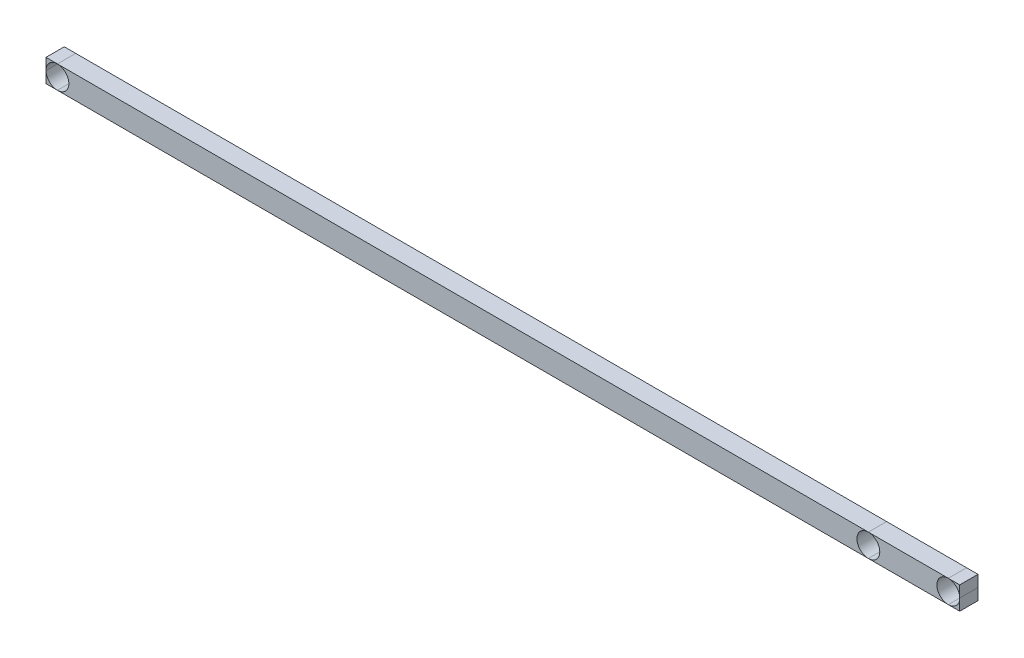
ISO-10303-21;
HEADER;
FILE_DESCRIPTION(('STEP AP214'),'2;1');
FILE_NAME('part.step','',(''),(''),'','','');
FILE_SCHEMA(('AUTOMOTIVE_DESIGN { 1 0 10303 214 1 1 1 1 }'));
ENDSEC;
DATA;
#1=APPLICATION_CONTEXT('core data for automotive mechanical design processes');
#2=APPLICATION_PROTOCOL_DEFINITION('international standard','automotive_design',2000,#1);
#3=PRODUCT_CONTEXT('',#1,'mechanical');
#4=PRODUCT('Part','Part','',(#3));
#5=PRODUCT_RELATED_PRODUCT_CATEGORY('part','',(#4));
#6=PRODUCT_DEFINITION_FORMATION('','',#4);
#7=PRODUCT_DEFINITION_CONTEXT('part definition',#1,'design');
#8=PRODUCT_DEFINITION('design','',#6,#7);
#9=PRODUCT_DEFINITION_SHAPE('','',#8);
#10=(LENGTH_UNIT() NAMED_UNIT(*) SI_UNIT(.MILLI.,.METRE.));
#11=(NAMED_UNIT(*) PLANE_ANGLE_UNIT() SI_UNIT($,.RADIAN.));
#12=(NAMED_UNIT(*) SI_UNIT($,.STERADIAN.) SOLID_ANGLE_UNIT());
#13=UNCERTAINTY_MEASURE_WITH_UNIT(LENGTH_MEASURE(1.E-05),#10,'distance_accuracy_value','');
#14=(GEOMETRIC_REPRESENTATION_CONTEXT(3) GLOBAL_UNCERTAINTY_ASSIGNED_CONTEXT((#13)) GLOBAL_UNIT_ASSIGNED_CONTEXT((#10,
#11,#12)) REPRESENTATION_CONTEXT('',''));
#15=CARTESIAN_POINT('',(0.,0.,0.));
#16=DIRECTION('',(0.,0.,1.));
#17=DIRECTION('',(1.,0.,0.));
#18=AXIS2_PLACEMENT_3D('',#15,#16,#17);
#19=CARTESIAN_POINT('',(0.,0.,4.));
#20=DIRECTION('',(1.,0.,0.));
#21=DIRECTION('',(0.,1.,0.));
#22=AXIS2_PLACEMENT_3D('',#19,#20,#21);
#23=PLANE('',#22);
#24=DIRECTION('',(0.,0.,1.));
#25=VECTOR('',#24,1.);
#26=CARTESIAN_POINT('',(0.,-2.5,-6.));
#27=LINE('',#26,#25);
#28=CARTESIAN_POINT('',(0.,-2.5,0.));
#29=VERTEX_POINT('',#28);
#30=CARTESIAN_POINT('',(0.,-2.5,4.));
#31=VERTEX_POINT('',#30);
#32=EDGE_CURVE('E62',#29,#31,#27,.T.);
#33=ORIENTED_EDGE('',*,*,#32,.F.);
#34=DIRECTION('',(0.,-1.,0.));
#35=VECTOR('',#34,1.);
#36=CARTESIAN_POINT('',(0.,0.,0.));
#37=LINE('',#36,#35);
#38=CARTESIAN_POINT('',(0.,-5.,0.));
#39=VERTEX_POINT('',#38);
#40=EDGE_CURVE('E97',#29,#39,#37,.T.);
#41=ORIENTED_EDGE('',*,*,#40,.T.);
#42=DIRECTION('',(0.,0.,-1.));
#43=VECTOR('',#42,1.);
#44=CARTESIAN_POINT('',(0.,-5.,4.));
#45=LINE('',#44,#43);
#46=CARTESIAN_POINT('',(0.,-5.,4.));
#47=VERTEX_POINT('',#46);
#48=EDGE_CURVE('E89',#47,#39,#45,.T.);
#49=ORIENTED_EDGE('',*,*,#48,.F.);
#50=DIRECTION('',(0.,-1.,0.));
#51=VECTOR('',#50,1.);
#52=CARTESIAN_POINT('',(0.,0.,4.));
#53=LINE('',#52,#51);
#54=EDGE_CURVE('E92',#31,#47,#53,.T.);
#55=ORIENTED_EDGE('',*,*,#54,.F.);
#56=EDGE_LOOP('',(#33,#41,#49,#55));
#57=FACE_BOUND('',#56,.T.);
#58=ADVANCED_FACE('F52',(#57),#23,.F.);
#59=CARTESIAN_POINT('',(0.,0.,4.));
#60=DIRECTION('',(0.,0.,1.));
#61=DIRECTION('',(1.,0.,0.));
#62=AXIS2_PLACEMENT_3D('',#59,#60,#61);
#63=PLANE('',#62);
#64=CARTESIAN_POINT('',(2.5,-2.5,4.));
#65=DIRECTION('',(0.,0.,1.));
#66=DIRECTION('',(1.,0.,0.));
#67=AXIS2_PLACEMENT_3D('',#64,#65,#66);
#68=CIRCLE('',#67,2.5);
#69=CARTESIAN_POINT('',(2.5,-5.,4.));
#70=VERTEX_POINT('',#69);
#71=EDGE_CURVE('E12',#31,#70,#68,.T.);
#72=ORIENTED_EDGE('',*,*,#71,.F.);
#73=ORIENTED_EDGE('',*,*,#54,.T.);
#74=DIRECTION('',(1.,0.,0.));
#75=VECTOR('',#74,1.);
#76=CARTESIAN_POINT('',(0.,-5.,4.));
#77=LINE('',#76,#75);
#78=EDGE_CURVE('E56',#47,#70,#77,.T.);
#79=ORIENTED_EDGE('',*,*,#78,.T.);
#80=EDGE_LOOP('',(#72,#73,#79));
#81=FACE_BOUND('',#80,.T.);
#82=ADVANCED_FACE('F99',(#81),#63,.T.);
#83=CARTESIAN_POINT('',(0.,0.,0.));
#84=DIRECTION('',(0.,0.,1.));
#85=DIRECTION('',(1.,0.,0.));
#86=AXIS2_PLACEMENT_3D('',#83,#84,#85);
#87=PLANE('',#86);
#88=ORIENTED_EDGE('',*,*,#40,.F.);
#89=CARTESIAN_POINT('',(2.5,-2.5,0.));
#90=DIRECTION('',(0.,0.,1.));
#91=DIRECTION('',(1.,0.,0.));
#92=AXIS2_PLACEMENT_3D('',#89,#90,#91);
#93=CIRCLE('',#92,2.5);
#94=CARTESIAN_POINT('',(2.5,-5.,0.));
#95=VERTEX_POINT('',#94);
#96=EDGE_CURVE('E82',#29,#95,#93,.T.);
#97=ORIENTED_EDGE('',*,*,#96,.T.);
#98=DIRECTION('',(1.,0.,0.));
#99=VECTOR('',#98,1.);
#100=CARTESIAN_POINT('',(0.,-5.,0.));
#101=LINE('',#100,#99);
#102=EDGE_CURVE('E101',#39,#95,#101,.T.);
#103=ORIENTED_EDGE('',*,*,#102,.F.);
#104=EDGE_LOOP('',(#88,#97,#103));
#105=FACE_BOUND('',#104,.T.);
#106=ADVANCED_FACE('F108',(#105),#87,.F.);
#107=CARTESIAN_POINT('',(0.,-5.,4.));
#108=DIRECTION('',(0.,1.,0.));
#109=DIRECTION('',(0.,0.,1.));
#110=AXIS2_PLACEMENT_3D('',#107,#108,#109);
#111=PLANE('',#110);
#112=ORIENTED_EDGE('',*,*,#102,.T.);
#113=DIRECTION('',(0.,0.,1.));
#114=VECTOR('',#113,1.);
#115=CARTESIAN_POINT('',(2.5,-5.,-6.));
#116=LINE('',#115,#114);
#117=EDGE_CURVE('E69',#95,#70,#116,.T.);
#118=ORIENTED_EDGE('',*,*,#117,.T.);
#119=ORIENTED_EDGE('',*,*,#78,.F.);
#120=ORIENTED_EDGE('',*,*,#48,.T.);
#121=EDGE_LOOP('',(#112,#118,#119,#120));
#122=FACE_BOUND('',#121,.T.);
#123=ADVANCED_FACE('F54',(#122),#111,.F.);
#124=CARTESIAN_POINT('',(2.5,-2.5,-6.));
#125=DIRECTION('',(0.,0.,1.));
#126=DIRECTION('',(1.,0.,0.));
#127=AXIS2_PLACEMENT_3D('',#124,#125,#126);
#128=CYLINDRICAL_SURFACE('',#127,2.5);
#129=ORIENTED_EDGE('',*,*,#96,.F.);
#130=ORIENTED_EDGE('',*,*,#32,.T.);
#131=ORIENTED_EDGE('',*,*,#71,.T.);
#132=ORIENTED_EDGE('',*,*,#117,.F.);
#133=EDGE_LOOP('',(#129,#130,#131,#132));
#134=FACE_BOUND('',#133,.T.);
#135=ADVANCED_FACE('F85',(#134),#128,.F.);
#136=CLOSED_SHELL('',(#58,#82,#106,#123,#135));
#137=MANIFOLD_SOLID_BREP('B2',#136);
#138=CARTESIAN_POINT('',(0.,0.,4.));
#139=DIRECTION('',(0.,0.,1.));
#140=DIRECTION('',(1.,0.,0.));
#141=AXIS2_PLACEMENT_3D('',#138,#139,#140);
#142=PLANE('',#141);
#143=CARTESIAN_POINT('',(197.5,-2.5,4.));
#144=DIRECTION('',(0.,0.,1.));
#145=DIRECTION('',(1.,0.,0.));
#146=AXIS2_PLACEMENT_3D('',#143,#144,#145);
#147=CIRCLE('',#146,2.5);
#148=CARTESIAN_POINT('',(197.5,0.,4.));
#149=VERTEX_POINT('',#148);
#150=CARTESIAN_POINT('',(197.5,-5.,4.));
#151=VERTEX_POINT('',#150);
#152=EDGE_CURVE('E50',#149,#151,#147,.T.);
#153=ORIENTED_EDGE('',*,*,#152,.F.);
#154=DIRECTION('',(-1.,0.,0.));
#155=VECTOR('',#154,1.);
#156=CARTESIAN_POINT('',(0.,0.,4.));
#157=LINE('',#156,#155);
#158=CARTESIAN_POINT('',(180.,0.,4.));
#159=VERTEX_POINT('',#158);
#160=EDGE_CURVE('E221',#149,#159,#157,.T.);
#161=ORIENTED_EDGE('',*,*,#160,.T.);
#162=CARTESIAN_POINT('',(180.,-2.5,4.));
#163=DIRECTION('',(0.,0.,1.));
#164=DIRECTION('',(1.,0.,0.));
#165=AXIS2_PLACEMENT_3D('',#162,#163,#164);
#166=CIRCLE('',#165,2.5);
#167=CARTESIAN_POINT('',(180.,-5.,4.));
#168=VERTEX_POINT('',#167);
#169=EDGE_CURVE('E215',#168,#159,#166,.T.);
#170=ORIENTED_EDGE('',*,*,#169,.F.);
#171=DIRECTION('',(1.,0.,0.));
#172=VECTOR('',#171,1.);
#173=CARTESIAN_POINT('',(0.,-5.,4.));
#174=LINE('',#173,#172);
#175=EDGE_CURVE('E164',#168,#151,#174,.T.);
#176=ORIENTED_EDGE('',*,*,#175,.T.);
#177=EDGE_LOOP('',(#153,#161,#170,#176));
#178=FACE_BOUND('',#177,.T.);
#179=ADVANCED_FACE('F160',(#178),#142,.T.);
#180=CARTESIAN_POINT('',(0.,0.,0.));
#181=DIRECTION('',(0.,0.,1.));
#182=DIRECTION('',(1.,0.,0.));
#183=AXIS2_PLACEMENT_3D('',#180,#181,#182);
#184=PLANE('',#183);
#185=DIRECTION('',(-1.,0.,0.));
#186=VECTOR('',#185,1.);
#187=CARTESIAN_POINT('',(0.,0.,0.));
#188=LINE('',#187,#186);
#189=CARTESIAN_POINT('',(197.5,0.,0.));
#190=VERTEX_POINT('',#189);
#191=CARTESIAN_POINT('',(180.,0.,0.));
#192=VERTEX_POINT('',#191);
#193=EDGE_CURVE('E207',#190,#192,#188,.T.);
#194=ORIENTED_EDGE('',*,*,#193,.F.);
#195=CARTESIAN_POINT('',(197.5,-2.5,0.));
#196=DIRECTION('',(0.,0.,1.));
#197=DIRECTION('',(1.,0.,0.));
#198=AXIS2_PLACEMENT_3D('',#195,#196,#197);
#199=CIRCLE('',#198,2.5);
#200=CARTESIAN_POINT('',(197.5,-5.,0.));
#201=VERTEX_POINT('',#200);
#202=EDGE_CURVE('E208',#190,#201,#199,.T.);
#203=ORIENTED_EDGE('',*,*,#202,.T.);
#204=DIRECTION('',(1.,0.,0.));
#205=VECTOR('',#204,1.);
#206=CARTESIAN_POINT('',(0.,-5.,0.));
#207=LINE('',#206,#205);
#208=CARTESIAN_POINT('',(180.,-5.,0.));
#209=VERTEX_POINT('',#208);
#210=EDGE_CURVE('E211',#209,#201,#207,.T.);
#211=ORIENTED_EDGE('',*,*,#210,.F.);
#212=CARTESIAN_POINT('',(180.,-2.5,0.));
#213=DIRECTION('',(0.,0.,1.));
#214=DIRECTION('',(1.,0.,0.));
#215=AXIS2_PLACEMENT_3D('',#212,#213,#214);
#216=CIRCLE('',#215,2.5);
#217=EDGE_CURVE('E195',#209,#192,#216,.T.);
#218=ORIENTED_EDGE('',*,*,#217,.T.);
#219=EDGE_LOOP('',(#194,#203,#211,#218));
#220=FACE_BOUND('',#219,.T.);
#221=ADVANCED_FACE('F217',(#220),#184,.F.);
#222=CARTESIAN_POINT('',(0.,0.,4.));
#223=DIRECTION('',(0.,-1.,0.));
#224=DIRECTION('',(0.,0.,-1.));
#225=AXIS2_PLACEMENT_3D('',#222,#223,#224);
#226=PLANE('',#225);
#227=DIRECTION('',(0.,0.,1.));
#228=VECTOR('',#227,1.);
#229=CARTESIAN_POINT('',(197.5,0.,-6.));
#230=LINE('',#229,#228);
#231=EDGE_CURVE('E170',#190,#149,#230,.T.);
#232=ORIENTED_EDGE('',*,*,#231,.F.);
#233=ORIENTED_EDGE('',*,*,#193,.T.);
#234=DIRECTION('',(0.,0.,1.));
#235=VECTOR('',#234,1.);
#236=CARTESIAN_POINT('',(180.,0.,-6.));
#237=LINE('',#236,#235);
#238=EDGE_CURVE('E202',#192,#159,#237,.T.);
#239=ORIENTED_EDGE('',*,*,#238,.T.);
#240=ORIENTED_EDGE('',*,*,#160,.F.);
#241=EDGE_LOOP('',(#232,#233,#239,#240));
#242=FACE_BOUND('',#241,.T.);
#243=ADVANCED_FACE('F233',(#242),#226,.F.);
#244=CARTESIAN_POINT('',(0.,-5.,4.));
#245=DIRECTION('',(0.,1.,0.));
#246=DIRECTION('',(0.,0.,1.));
#247=AXIS2_PLACEMENT_3D('',#244,#245,#246);
#248=PLANE('',#247);
#249=ORIENTED_EDGE('',*,*,#210,.T.);
#250=DIRECTION('',(0.,0.,1.));
#251=VECTOR('',#250,1.);
#252=CARTESIAN_POINT('',(197.5,-5.,-6.));
#253=LINE('',#252,#251);
#254=EDGE_CURVE('E178',#201,#151,#253,.T.);
#255=ORIENTED_EDGE('',*,*,#254,.T.);
#256=ORIENTED_EDGE('',*,*,#175,.F.);
#257=DIRECTION('',(0.,0.,1.));
#258=VECTOR('',#257,1.);
#259=CARTESIAN_POINT('',(180.,-5.,-6.));
#260=LINE('',#259,#258);
#261=EDGE_CURVE('E199',#209,#168,#260,.T.);
#262=ORIENTED_EDGE('',*,*,#261,.F.);
#263=EDGE_LOOP('',(#249,#255,#256,#262));
#264=FACE_BOUND('',#263,.T.);
#265=ADVANCED_FACE('F162',(#264),#248,.F.);
#266=CARTESIAN_POINT('',(180.,-2.5,-6.));
#267=DIRECTION('',(0.,0.,1.));
#268=DIRECTION('',(1.,0.,0.));
#269=AXIS2_PLACEMENT_3D('',#266,#267,#268);
#270=CYLINDRICAL_SURFACE('',#269,2.5);
#271=ORIENTED_EDGE('',*,*,#261,.T.);
#272=ORIENTED_EDGE('',*,*,#169,.T.);
#273=ORIENTED_EDGE('',*,*,#238,.F.);
#274=ORIENTED_EDGE('',*,*,#217,.F.);
#275=EDGE_LOOP('',(#271,#272,#273,#274));
#276=FACE_BOUND('',#275,.T.);
#277=ADVANCED_FACE('F197',(#276),#270,.F.);
#278=CARTESIAN_POINT('',(197.5,-2.5,-6.));
#279=DIRECTION('',(0.,0.,1.));
#280=DIRECTION('',(1.,0.,0.));
#281=AXIS2_PLACEMENT_3D('',#278,#279,#280);
#282=CYLINDRICAL_SURFACE('',#281,2.5);
#283=ORIENTED_EDGE('',*,*,#202,.F.);
#284=ORIENTED_EDGE('',*,*,#231,.T.);
#285=ORIENTED_EDGE('',*,*,#152,.T.);
#286=ORIENTED_EDGE('',*,*,#254,.F.);
#287=EDGE_LOOP('',(#283,#284,#285,#286));
#288=FACE_BOUND('',#287,.T.);
#289=ADVANCED_FACE('F230',(#288),#282,.F.);
#290=CLOSED_SHELL('',(#179,#221,#243,#265,#277,#289));
#291=MANIFOLD_SOLID_BREP('B6',#290);
#292=CARTESIAN_POINT('',(0.,0.,4.));
#293=DIRECTION('',(0.,0.,1.));
#294=DIRECTION('',(1.,0.,0.));
#295=AXIS2_PLACEMENT_3D('',#292,#293,#294);
#296=PLANE('',#295);
#297=CARTESIAN_POINT('',(2.5,-2.5,4.));
#298=DIRECTION('',(0.,0.,1.));
#299=DIRECTION('',(1.,0.,0.));
#300=AXIS2_PLACEMENT_3D('',#297,#298,#299);
#301=CIRCLE('',#300,2.5);
#302=CARTESIAN_POINT('',(2.5,-5.,4.));
#303=VERTEX_POINT('',#302);
#304=CARTESIAN_POINT('',(2.5,0.,4.));
#305=VERTEX_POINT('',#304);
#306=EDGE_CURVE('E158',#303,#305,#301,.T.);
#307=ORIENTED_EDGE('',*,*,#306,.F.);
#308=DIRECTION('',(1.,0.,0.));
#309=VECTOR('',#308,1.);
#310=CARTESIAN_POINT('',(0.,-5.,4.));
#311=LINE('',#310,#309);
#312=CARTESIAN_POINT('',(180.,-5.,4.));
#313=VERTEX_POINT('',#312);
#314=EDGE_CURVE('E298',#303,#313,#311,.T.);
#315=ORIENTED_EDGE('',*,*,#314,.T.);
#316=CARTESIAN_POINT('',(180.,-2.5,4.));
#317=DIRECTION('',(0.,0.,1.));
#318=DIRECTION('',(1.,0.,0.));
#319=AXIS2_PLACEMENT_3D('',#316,#317,#318);
#320=CIRCLE('',#319,2.5);
#321=CARTESIAN_POINT('',(180.,0.,4.));
#322=VERTEX_POINT('',#321);
#323=EDGE_CURVE('E341',#322,#313,#320,.T.);
#324=ORIENTED_EDGE('',*,*,#323,.F.);
#325=DIRECTION('',(-1.,0.,0.));
#326=VECTOR('',#325,1.);
#327=CARTESIAN_POINT('',(0.,0.,4.));
#328=LINE('',#327,#326);
#329=EDGE_CURVE('E357',#322,#305,#328,.T.);
#330=ORIENTED_EDGE('',*,*,#329,.T.);
#331=EDGE_LOOP('',(#307,#315,#324,#330));
#332=FACE_BOUND('',#331,.T.);
#333=ADVANCED_FACE('F294',(#332),#296,.T.);
#334=CARTESIAN_POINT('',(0.,0.,0.));
#335=DIRECTION('',(0.,0.,1.));
#336=DIRECTION('',(1.,0.,0.));
#337=AXIS2_PLACEMENT_3D('',#334,#335,#336);
#338=PLANE('',#337);
#339=DIRECTION('',(1.,0.,0.));
#340=VECTOR('',#339,1.);
#341=CARTESIAN_POINT('',(0.,-5.,0.));
#342=LINE('',#341,#340);
#343=CARTESIAN_POINT('',(2.5,-5.,0.));
#344=VERTEX_POINT('',#343);
#345=CARTESIAN_POINT('',(180.,-5.,0.));
#346=VERTEX_POINT('',#345);
#347=EDGE_CURVE('E344',#344,#346,#342,.T.);
#348=ORIENTED_EDGE('',*,*,#347,.F.);
#349=CARTESIAN_POINT('',(2.5,-2.5,0.));
#350=DIRECTION('',(0.,0.,1.));
#351=DIRECTION('',(1.,0.,0.));
#352=AXIS2_PLACEMENT_3D('',#349,#350,#351);
#353=CIRCLE('',#352,2.5);
#354=CARTESIAN_POINT('',(2.5,0.,0.));
#355=VERTEX_POINT('',#354);
#356=EDGE_CURVE('E313',#344,#355,#353,.T.);
#357=ORIENTED_EDGE('',*,*,#356,.T.);
#358=DIRECTION('',(-1.,0.,0.));
#359=VECTOR('',#358,1.);
#360=CARTESIAN_POINT('',(0.,0.,0.));
#361=LINE('',#360,#359);
#362=CARTESIAN_POINT('',(180.,0.,0.));
#363=VERTEX_POINT('',#362);
#364=EDGE_CURVE('E354',#363,#355,#361,.T.);
#365=ORIENTED_EDGE('',*,*,#364,.F.);
#366=CARTESIAN_POINT('',(180.,-2.5,0.));
#367=DIRECTION('',(0.,0.,1.));
#368=DIRECTION('',(1.,0.,0.));
#369=AXIS2_PLACEMENT_3D('',#366,#367,#368);
#370=CIRCLE('',#369,2.5);
#371=EDGE_CURVE('E329',#363,#346,#370,.T.);
#372=ORIENTED_EDGE('',*,*,#371,.T.);
#373=EDGE_LOOP('',(#348,#357,#365,#372));
#374=FACE_BOUND('',#373,.T.);
#375=ADVANCED_FACE('F352',(#374),#338,.F.);
#376=CARTESIAN_POINT('',(0.,0.,4.));
#377=DIRECTION('',(0.,-1.,0.));
#378=DIRECTION('',(0.,0.,-1.));
#379=AXIS2_PLACEMENT_3D('',#376,#377,#378);
#380=PLANE('',#379);
#381=ORIENTED_EDGE('',*,*,#364,.T.);
#382=DIRECTION('',(0.,0.,1.));
#383=VECTOR('',#382,1.);
#384=CARTESIAN_POINT('',(2.5,0.,-6.));
#385=LINE('',#384,#383);
#386=EDGE_CURVE('E349',#355,#305,#385,.T.);
#387=ORIENTED_EDGE('',*,*,#386,.T.);
#388=ORIENTED_EDGE('',*,*,#329,.F.);
#389=DIRECTION('',(0.,0.,1.));
#390=VECTOR('',#389,1.);
#391=CARTESIAN_POINT('',(180.,0.,-6.));
#392=LINE('',#391,#390);
#393=EDGE_CURVE('E332',#363,#322,#392,.T.);
#394=ORIENTED_EDGE('',*,*,#393,.F.);
#395=EDGE_LOOP('',(#381,#387,#388,#394));
#396=FACE_BOUND('',#395,.T.);
#397=ADVANCED_FACE('F364',(#396),#380,.F.);
#398=CARTESIAN_POINT('',(0.,-5.,4.));
#399=DIRECTION('',(0.,1.,0.));
#400=DIRECTION('',(0.,0.,1.));
#401=AXIS2_PLACEMENT_3D('',#398,#399,#400);
#402=PLANE('',#401);
#403=DIRECTION('',(0.,0.,1.));
#404=VECTOR('',#403,1.);
#405=CARTESIAN_POINT('',(2.5,-5.,-6.));
#406=LINE('',#405,#404);
#407=EDGE_CURVE('E304',#344,#303,#406,.T.);
#408=ORIENTED_EDGE('',*,*,#407,.F.);
#409=ORIENTED_EDGE('',*,*,#347,.T.);
#410=DIRECTION('',(0.,0.,1.));
#411=VECTOR('',#410,1.);
#412=CARTESIAN_POINT('',(180.,-5.,-6.));
#413=LINE('',#412,#411);
#414=EDGE_CURVE('E337',#346,#313,#413,.T.);
#415=ORIENTED_EDGE('',*,*,#414,.T.);
#416=ORIENTED_EDGE('',*,*,#314,.F.);
#417=EDGE_LOOP('',(#408,#409,#415,#416));
#418=FACE_BOUND('',#417,.T.);
#419=ADVANCED_FACE('F347',(#418),#402,.F.);
#420=CARTESIAN_POINT('',(180.,-2.5,-6.));
#421=DIRECTION('',(0.,0.,1.));
#422=DIRECTION('',(1.,0.,0.));
#423=AXIS2_PLACEMENT_3D('',#420,#421,#422);
#424=CYLINDRICAL_SURFACE('',#423,2.5);
#425=ORIENTED_EDGE('',*,*,#371,.F.);
#426=ORIENTED_EDGE('',*,*,#393,.T.);
#427=ORIENTED_EDGE('',*,*,#323,.T.);
#428=ORIENTED_EDGE('',*,*,#414,.F.);
#429=EDGE_LOOP('',(#425,#426,#427,#428));
#430=FACE_BOUND('',#429,.T.);
#431=ADVANCED_FACE('F339',(#430),#424,.F.);
#432=CARTESIAN_POINT('',(2.5,-2.5,-6.));
#433=DIRECTION('',(0.,0.,1.));
#434=DIRECTION('',(1.,0.,0.));
#435=AXIS2_PLACEMENT_3D('',#432,#433,#434);
#436=CYLINDRICAL_SURFACE('',#435,2.5);
#437=ORIENTED_EDGE('',*,*,#407,.T.);
#438=ORIENTED_EDGE('',*,*,#306,.T.);
#439=ORIENTED_EDGE('',*,*,#386,.F.);
#440=ORIENTED_EDGE('',*,*,#356,.F.);
#441=EDGE_LOOP('',(#437,#438,#439,#440));
#442=FACE_BOUND('',#441,.T.);
#443=ADVANCED_FACE('F296',(#442),#436,.F.);
#444=CLOSED_SHELL('',(#333,#375,#397,#419,#431,#443));
#445=MANIFOLD_SOLID_BREP('B44',#444);
#446=CARTESIAN_POINT('',(0.,0.,4.));
#447=DIRECTION('',(0.,0.,1.));
#448=DIRECTION('',(1.,0.,0.));
#449=AXIS2_PLACEMENT_3D('',#446,#447,#448);
#450=PLANE('',#449);
#451=CARTESIAN_POINT('',(2.5,-2.5,4.));
#452=DIRECTION('',(0.,0.,1.));
#453=DIRECTION('',(1.,0.,0.));
#454=AXIS2_PLACEMENT_3D('',#451,#452,#453);
#455=CIRCLE('',#454,2.5);
#456=CARTESIAN_POINT('',(2.5,0.,4.));
#457=VERTEX_POINT('',#456);
#458=CARTESIAN_POINT('',(0.,-2.5,4.));
#459=VERTEX_POINT('',#458);
#460=EDGE_CURVE('E292',#457,#459,#455,.T.);
#461=ORIENTED_EDGE('',*,*,#460,.F.);
#462=DIRECTION('',(-1.,0.,0.));
#463=VECTOR('',#462,1.);
#464=CARTESIAN_POINT('',(0.,0.,4.));
#465=LINE('',#464,#463);
#466=CARTESIAN_POINT('',(0.,0.,4.));
#467=VERTEX_POINT('',#466);
#468=EDGE_CURVE('E469',#457,#467,#465,.T.);
#469=ORIENTED_EDGE('',*,*,#468,.T.);
#470=DIRECTION('',(0.,-1.,0.));
#471=VECTOR('',#470,1.);
#472=CARTESIAN_POINT('',(0.,0.,4.));
#473=LINE('',#472,#471);
#474=EDGE_CURVE('E464',#467,#459,#473,.T.);
#475=ORIENTED_EDGE('',*,*,#474,.T.);
#476=EDGE_LOOP('',(#461,#469,#475));
#477=FACE_BOUND('',#476,.T.);
#478=ADVANCED_FACE('F428',(#477),#450,.T.);
#479=CARTESIAN_POINT('',(0.,0.,0.));
#480=DIRECTION('',(0.,0.,1.));
#481=DIRECTION('',(1.,0.,0.));
#482=AXIS2_PLACEMENT_3D('',#479,#480,#481);
#483=PLANE('',#482);
#484=DIRECTION('',(-1.,0.,0.));
#485=VECTOR('',#484,1.);
#486=CARTESIAN_POINT('',(0.,0.,0.));
#487=LINE('',#486,#485);
#488=CARTESIAN_POINT('',(2.5,0.,0.));
#489=VERTEX_POINT('',#488);
#490=CARTESIAN_POINT('',(0.,0.,0.));
#491=VERTEX_POINT('',#490);
#492=EDGE_CURVE('E463',#489,#491,#487,.T.);
#493=ORIENTED_EDGE('',*,*,#492,.F.);
#494=CARTESIAN_POINT('',(2.5,-2.5,0.));
#495=DIRECTION('',(0.,0.,1.));
#496=DIRECTION('',(1.,0.,0.));
#497=AXIS2_PLACEMENT_3D('',#494,#495,#496);
#498=CIRCLE('',#497,2.5);
#499=CARTESIAN_POINT('',(0.,-2.5,0.));
#500=VERTEX_POINT('',#499);
#501=EDGE_CURVE('E432',#489,#500,#498,.T.);
#502=ORIENTED_EDGE('',*,*,#501,.T.);
#503=DIRECTION('',(0.,-1.,0.));
#504=VECTOR('',#503,1.);
#505=CARTESIAN_POINT('',(0.,0.,0.));
#506=LINE('',#505,#504);
#507=EDGE_CURVE('E474',#491,#500,#506,.T.);
#508=ORIENTED_EDGE('',*,*,#507,.F.);
#509=EDGE_LOOP('',(#493,#502,#508));
#510=FACE_BOUND('',#509,.T.);
#511=ADVANCED_FACE('F473',(#510),#483,.F.);
#512=CARTESIAN_POINT('',(0.,0.,4.));
#513=DIRECTION('',(0.,-1.,0.));
#514=DIRECTION('',(0.,0.,-1.));
#515=AXIS2_PLACEMENT_3D('',#512,#513,#514);
#516=PLANE('',#515);
#517=DIRECTION('',(0.,0.,1.));
#518=VECTOR('',#517,1.);
#519=CARTESIAN_POINT('',(2.5,0.,-6.));
#520=LINE('',#519,#518);
#521=EDGE_CURVE('E438',#489,#457,#520,.T.);
#522=ORIENTED_EDGE('',*,*,#521,.F.);
#523=ORIENTED_EDGE('',*,*,#492,.T.);
#524=DIRECTION('',(0.,0.,-1.));
#525=VECTOR('',#524,1.);
#526=CARTESIAN_POINT('',(0.,0.,4.));
#527=LINE('',#526,#525);
#528=EDGE_CURVE('E471',#467,#491,#527,.T.);
#529=ORIENTED_EDGE('',*,*,#528,.F.);
#530=ORIENTED_EDGE('',*,*,#468,.F.);
#531=EDGE_LOOP('',(#522,#523,#529,#530));
#532=FACE_BOUND('',#531,.T.);
#533=ADVANCED_FACE('F466',(#532),#516,.F.);
#534=CARTESIAN_POINT('',(0.,0.,4.));
#535=DIRECTION('',(1.,0.,0.));
#536=DIRECTION('',(0.,1.,0.));
#537=AXIS2_PLACEMENT_3D('',#534,#535,#536);
#538=PLANE('',#537);
#539=ORIENTED_EDGE('',*,*,#507,.T.);
#540=DIRECTION('',(0.,0.,1.));
#541=VECTOR('',#540,1.);
#542=CARTESIAN_POINT('',(0.,-2.5,-6.));
#543=LINE('',#542,#541);
#544=EDGE_CURVE('E445',#500,#459,#543,.T.);
#545=ORIENTED_EDGE('',*,*,#544,.T.);
#546=ORIENTED_EDGE('',*,*,#474,.F.);
#547=ORIENTED_EDGE('',*,*,#528,.T.);
#548=EDGE_LOOP('',(#539,#545,#546,#547));
#549=FACE_BOUND('',#548,.T.);
#550=ADVANCED_FACE('F483',(#549),#538,.F.);
#551=CARTESIAN_POINT('',(2.5,-2.5,-6.));
#552=DIRECTION('',(0.,0.,1.));
#553=DIRECTION('',(1.,0.,0.));
#554=AXIS2_PLACEMENT_3D('',#551,#552,#553);
#555=CYLINDRICAL_SURFACE('',#554,2.5);
#556=ORIENTED_EDGE('',*,*,#501,.F.);
#557=ORIENTED_EDGE('',*,*,#521,.T.);
#558=ORIENTED_EDGE('',*,*,#460,.T.);
#559=ORIENTED_EDGE('',*,*,#544,.F.);
#560=EDGE_LOOP('',(#556,#557,#558,#559));
#561=FACE_BOUND('',#560,.T.);
#562=ADVANCED_FACE('F430',(#561),#555,.F.);
#563=CLOSED_SHELL('',(#478,#511,#533,#550,#562));
#564=MANIFOLD_SOLID_BREP('B152',#563);
#565=CARTESIAN_POINT('',(0.,0.,4.));
#566=DIRECTION('',(0.,0.,1.));
#567=DIRECTION('',(1.,0.,0.));
#568=AXIS2_PLACEMENT_3D('',#565,#566,#567);
#569=PLANE('',#568);
#570=CARTESIAN_POINT('',(197.5,-2.5,4.));
#571=DIRECTION('',(0.,0.,1.));
#572=DIRECTION('',(1.,0.,0.));
#573=AXIS2_PLACEMENT_3D('',#570,#571,#572);
#574=CIRCLE('',#573,2.5);
#575=CARTESIAN_POINT('',(197.5,-5.,4.));
#576=VERTEX_POINT('',#575);
#577=CARTESIAN_POINT('',(200.,-2.5,4.));
#578=VERTEX_POINT('',#577);
#579=EDGE_CURVE('E426',#576,#578,#574,.T.);
#580=ORIENTED_EDGE('',*,*,#579,.F.);
#581=DIRECTION('',(1.,0.,0.));
#582=VECTOR('',#581,1.);
#583=CARTESIAN_POINT('',(0.,-5.,4.));
#584=LINE('',#583,#582);
#585=CARTESIAN_POINT('',(200.,-5.,4.));
#586=VERTEX_POINT('',#585);
#587=EDGE_CURVE('E539',#576,#586,#584,.T.);
#588=ORIENTED_EDGE('',*,*,#587,.T.);
#589=DIRECTION('',(0.,1.,0.));
#590=VECTOR('',#589,1.);
#591=CARTESIAN_POINT('',(200.,-5.,4.));
#592=LINE('',#591,#590);
#593=EDGE_CURVE('E575',#586,#578,#592,.T.);
#594=ORIENTED_EDGE('',*,*,#593,.T.);
#595=EDGE_LOOP('',(#580,#588,#594));
#596=FACE_BOUND('',#595,.T.);
#597=ADVANCED_FACE('F535',(#596),#569,.T.);
#598=CARTESIAN_POINT('',(0.,0.,0.));
#599=DIRECTION('',(0.,0.,1.));
#600=DIRECTION('',(1.,0.,0.));
#601=AXIS2_PLACEMENT_3D('',#598,#599,#600);
#602=PLANE('',#601);
#603=DIRECTION('',(1.,0.,0.));
#604=VECTOR('',#603,1.);
#605=CARTESIAN_POINT('',(0.,-5.,0.));
#606=LINE('',#605,#604);
#607=CARTESIAN_POINT('',(197.5,-5.,0.));
#608=VERTEX_POINT('',#607);
#609=CARTESIAN_POINT('',(200.,-5.,0.));
#610=VERTEX_POINT('',#609);
#611=EDGE_CURVE('E586',#608,#610,#606,.T.);
#612=ORIENTED_EDGE('',*,*,#611,.F.);
#613=CARTESIAN_POINT('',(197.5,-2.5,0.));
#614=DIRECTION('',(0.,0.,1.));
#615=DIRECTION('',(1.,0.,0.));
#616=AXIS2_PLACEMENT_3D('',#613,#614,#615);
#617=CIRCLE('',#616,2.5);
#618=CARTESIAN_POINT('',(200.,-2.5,0.));
#619=VERTEX_POINT('',#618);
#620=EDGE_CURVE('E553',#608,#619,#617,.T.);
#621=ORIENTED_EDGE('',*,*,#620,.T.);
#622=DIRECTION('',(0.,1.,0.));
#623=VECTOR('',#622,1.);
#624=CARTESIAN_POINT('',(200.,-5.,0.));
#625=LINE('',#624,#623);
#626=EDGE_CURVE('E577',#610,#619,#625,.T.);
#627=ORIENTED_EDGE('',*,*,#626,.F.);
#628=EDGE_LOOP('',(#612,#621,#627));
#629=FACE_BOUND('',#628,.T.);
#630=ADVANCED_FACE('F590',(#629),#602,.F.);
#631=CARTESIAN_POINT('',(200.,-5.,4.));
#632=DIRECTION('',(-1.,0.,0.));
#633=DIRECTION('',(0.,0.,1.));
#634=AXIS2_PLACEMENT_3D('',#631,#632,#633);
#635=PLANE('',#634);
#636=ORIENTED_EDGE('',*,*,#626,.T.);
#637=DIRECTION('',(0.,0.,1.));
#638=VECTOR('',#637,1.);
#639=CARTESIAN_POINT('',(200.,-2.5,-6.));
#640=LINE('',#639,#638);
#641=EDGE_CURVE('E567',#619,#578,#640,.T.);
#642=ORIENTED_EDGE('',*,*,#641,.T.);
#643=ORIENTED_EDGE('',*,*,#593,.F.);
#644=DIRECTION('',(0.,0.,-1.));
#645=VECTOR('',#644,1.);
#646=CARTESIAN_POINT('',(200.,-5.,4.));
#647=LINE('',#646,#645);
#648=EDGE_CURVE('E578',#586,#610,#647,.T.);
#649=ORIENTED_EDGE('',*,*,#648,.T.);
#650=EDGE_LOOP('',(#636,#642,#643,#649));
#651=FACE_BOUND('',#650,.T.);
#652=ADVANCED_FACE('F573',(#651),#635,.F.);
#653=CARTESIAN_POINT('',(0.,-5.,4.));
#654=DIRECTION('',(0.,1.,0.));
#655=DIRECTION('',(0.,0.,1.));
#656=AXIS2_PLACEMENT_3D('',#653,#654,#655);
#657=PLANE('',#656);
#658=DIRECTION('',(0.,0.,1.));
#659=VECTOR('',#658,1.);
#660=CARTESIAN_POINT('',(197.5,-5.,-6.));
#661=LINE('',#660,#659);
#662=EDGE_CURVE('E545',#608,#576,#661,.T.);
#663=ORIENTED_EDGE('',*,*,#662,.F.);
#664=ORIENTED_EDGE('',*,*,#611,.T.);
#665=ORIENTED_EDGE('',*,*,#648,.F.);
#666=ORIENTED_EDGE('',*,*,#587,.F.);
#667=EDGE_LOOP('',(#663,#664,#665,#666));
#668=FACE_BOUND('',#667,.T.);
#669=ADVANCED_FACE('F597',(#668),#657,.F.);
#670=CARTESIAN_POINT('',(197.5,-2.5,-6.));
#671=DIRECTION('',(0.,0.,1.));
#672=DIRECTION('',(1.,0.,0.));
#673=AXIS2_PLACEMENT_3D('',#670,#671,#672);
#674=CYLINDRICAL_SURFACE('',#673,2.5);
#675=ORIENTED_EDGE('',*,*,#662,.T.);
#676=ORIENTED_EDGE('',*,*,#579,.T.);
#677=ORIENTED_EDGE('',*,*,#641,.F.);
#678=ORIENTED_EDGE('',*,*,#620,.F.);
#679=EDGE_LOOP('',(#675,#676,#677,#678));
#680=FACE_BOUND('',#679,.T.);
#681=ADVANCED_FACE('F537',(#680),#674,.F.);
#682=CLOSED_SHELL('',(#597,#630,#652,#669,#681));
#683=MANIFOLD_SOLID_BREP('B286',#682);
#684=CARTESIAN_POINT('',(0.,0.,4.));
#685=DIRECTION('',(0.,0.,1.));
#686=DIRECTION('',(1.,0.,0.));
#687=AXIS2_PLACEMENT_3D('',#684,#685,#686);
#688=PLANE('',#687);
#689=CARTESIAN_POINT('',(197.5,-2.5,4.));
#690=DIRECTION('',(0.,0.,1.));
#691=DIRECTION('',(1.,0.,0.));
#692=AXIS2_PLACEMENT_3D('',#689,#690,#691);
#693=CIRCLE('',#692,2.5);
#694=CARTESIAN_POINT('',(200.,-2.5,4.));
#695=VERTEX_POINT('',#694);
#696=CARTESIAN_POINT('',(197.5,0.,4.));
#697=VERTEX_POINT('',#696);
#698=EDGE_CURVE('E665',#695,#697,#693,.T.);
#699=ORIENTED_EDGE('',*,*,#698,.F.);
#700=DIRECTION('',(0.,1.,0.));
#701=VECTOR('',#700,1.);
#702=CARTESIAN_POINT('',(200.,-5.,4.));
#703=LINE('',#702,#701);
#704=CARTESIAN_POINT('',(200.,0.,4.));
#705=VERTEX_POINT('',#704);
#706=EDGE_CURVE('E678',#695,#705,#703,.T.);
#707=ORIENTED_EDGE('',*,*,#706,.T.);
#708=DIRECTION('',(-1.,0.,0.));
#709=VECTOR('',#708,1.);
#710=CARTESIAN_POINT('',(0.,0.,4.));
#711=LINE('',#710,#709);
#712=EDGE_CURVE('E674',#705,#697,#711,.T.);
#713=ORIENTED_EDGE('',*,*,#712,.T.);
#714=EDGE_LOOP('',(#699,#707,#713));
#715=FACE_BOUND('',#714,.T.);
#716=ADVANCED_FACE('F633',(#715),#688,.T.);
#717=CARTESIAN_POINT('',(0.,0.,0.));
#718=DIRECTION('',(0.,0.,1.));
#719=DIRECTION('',(1.,0.,0.));
#720=AXIS2_PLACEMENT_3D('',#717,#718,#719);
#721=PLANE('',#720);
#722=DIRECTION('',(0.,1.,0.));
#723=VECTOR('',#722,1.);
#724=CARTESIAN_POINT('',(200.,-5.,0.));
#725=LINE('',#724,#723);
#726=CARTESIAN_POINT('',(200.,-2.5,0.));
#727=VERTEX_POINT('',#726);
#728=CARTESIAN_POINT('',(200.,0.,0.));
#729=VERTEX_POINT('',#728);
#730=EDGE_CURVE('E684',#727,#729,#725,.T.);
#731=ORIENTED_EDGE('',*,*,#730,.F.);
#732=CARTESIAN_POINT('',(197.5,-2.5,0.));
#733=DIRECTION('',(0.,0.,1.));
#734=DIRECTION('',(1.,0.,0.));
#735=AXIS2_PLACEMENT_3D('',#732,#733,#734);
#736=CIRCLE('',#735,2.5);
#737=CARTESIAN_POINT('',(197.5,0.,0.));
#738=VERTEX_POINT('',#737);
#739=EDGE_CURVE('E533',#727,#738,#736,.T.);
#740=ORIENTED_EDGE('',*,*,#739,.T.);
#741=DIRECTION('',(-1.,0.,0.));
#742=VECTOR('',#741,1.);
#743=CARTESIAN_POINT('',(0.,0.,0.));
#744=LINE('',#743,#742);
#745=EDGE_CURVE('E676',#729,#738,#744,.T.);
#746=ORIENTED_EDGE('',*,*,#745,.F.);
#747=EDGE_LOOP('',(#731,#740,#746));
#748=FACE_BOUND('',#747,.T.);
#749=ADVANCED_FACE('F689',(#748),#721,.F.);
#750=CARTESIAN_POINT('',(0.,0.,4.));
#751=DIRECTION('',(0.,-1.,0.));
#752=DIRECTION('',(0.,0.,-1.));
#753=AXIS2_PLACEMENT_3D('',#750,#751,#752);
#754=PLANE('',#753);
#755=ORIENTED_EDGE('',*,*,#745,.T.);
#756=DIRECTION('',(0.,0.,1.));
#757=VECTOR('',#756,1.);
#758=CARTESIAN_POINT('',(197.5,0.,-6.));
#759=LINE('',#758,#757);
#760=EDGE_CURVE('E648',#738,#697,#759,.T.);
#761=ORIENTED_EDGE('',*,*,#760,.T.);
#762=ORIENTED_EDGE('',*,*,#712,.F.);
#763=DIRECTION('',(0.,0.,-1.));
#764=VECTOR('',#763,1.);
#765=CARTESIAN_POINT('',(200.,0.,4.));
#766=LINE('',#765,#764);
#767=EDGE_CURVE('E641',#705,#729,#766,.T.);
#768=ORIENTED_EDGE('',*,*,#767,.T.);
#769=EDGE_LOOP('',(#755,#761,#762,#768));
#770=FACE_BOUND('',#769,.T.);
#771=ADVANCED_FACE('F672',(#770),#754,.F.);
#772=CARTESIAN_POINT('',(200.,-5.,4.));
#773=DIRECTION('',(-1.,0.,0.));
#774=DIRECTION('',(0.,0.,1.));
#775=AXIS2_PLACEMENT_3D('',#772,#773,#774);
#776=PLANE('',#775);
#777=DIRECTION('',(0.,0.,1.));
#778=VECTOR('',#777,1.);
#779=CARTESIAN_POINT('',(200.,-2.5,-6.));
#780=LINE('',#779,#778);
#781=EDGE_CURVE('E653',#727,#695,#780,.T.);
#782=ORIENTED_EDGE('',*,*,#781,.F.);
#783=ORIENTED_EDGE('',*,*,#730,.T.);
#784=ORIENTED_EDGE('',*,*,#767,.F.);
#785=ORIENTED_EDGE('',*,*,#706,.F.);
#786=EDGE_LOOP('',(#782,#783,#784,#785));
#787=FACE_BOUND('',#786,.T.);
#788=ADVANCED_FACE('F635',(#787),#776,.F.);
#789=CARTESIAN_POINT('',(197.5,-2.5,-6.));
#790=DIRECTION('',(0.,0.,1.));
#791=DIRECTION('',(1.,0.,0.));
#792=AXIS2_PLACEMENT_3D('',#789,#790,#791);
#793=CYLINDRICAL_SURFACE('',#792,2.5);
#794=ORIENTED_EDGE('',*,*,#781,.T.);
#795=ORIENTED_EDGE('',*,*,#698,.T.);
#796=ORIENTED_EDGE('',*,*,#760,.F.);
#797=ORIENTED_EDGE('',*,*,#739,.F.);
#798=EDGE_LOOP('',(#794,#795,#796,#797));
#799=FACE_BOUND('',#798,.T.);
#800=ADVANCED_FACE('F666',(#799),#793,.F.);
#801=CLOSED_SHELL('',(#716,#749,#771,#788,#800));
#802=MANIFOLD_SOLID_BREP('B420',#801);
#803=ADVANCED_BREP_SHAPE_REPRESENTATION('',(#18,#137,#291,#445,#564,#683,#802),#14);
#804=SHAPE_DEFINITION_REPRESENTATION(#9,#803);
ENDSEC;
END-ISO-10303-21;
